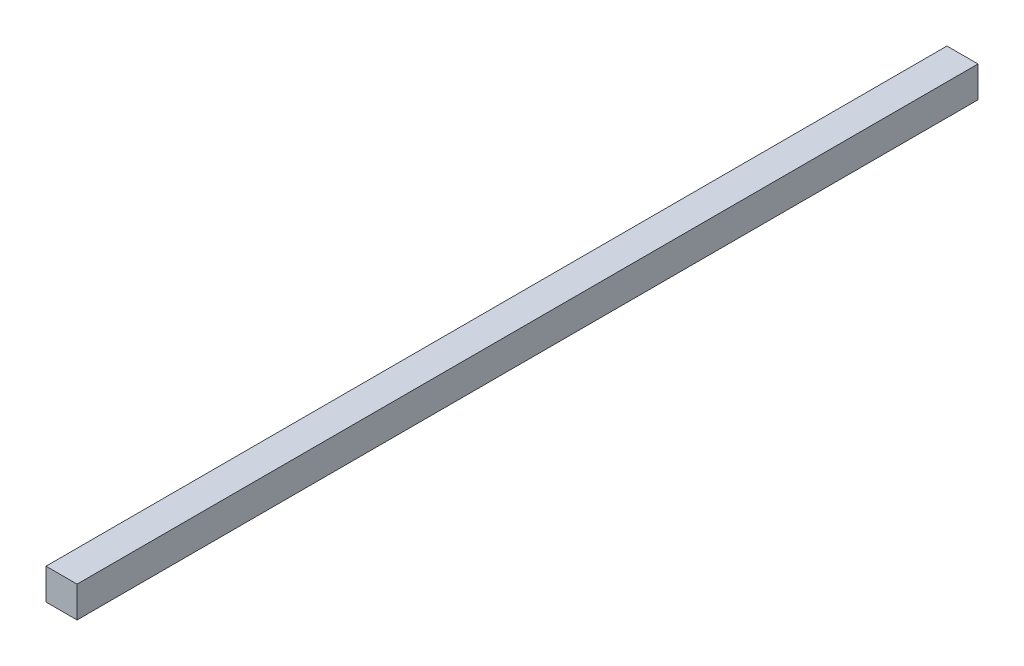
ISO-10303-21;
HEADER;
FILE_DESCRIPTION(('STEP AP214'),'2;1');
FILE_NAME('part.step','',(''),(''),'','','');
FILE_SCHEMA(('AUTOMOTIVE_DESIGN { 1 0 10303 214 1 1 1 1 }'));
ENDSEC;
DATA;
#1=APPLICATION_CONTEXT('core data for automotive mechanical design processes');
#2=APPLICATION_PROTOCOL_DEFINITION('international standard','automotive_design',2000,#1);
#3=PRODUCT_CONTEXT('',#1,'mechanical');
#4=PRODUCT('Part','Part','',(#3));
#5=PRODUCT_RELATED_PRODUCT_CATEGORY('part','',(#4));
#6=PRODUCT_DEFINITION_FORMATION('','',#4);
#7=PRODUCT_DEFINITION_CONTEXT('part definition',#1,'design');
#8=PRODUCT_DEFINITION('design','',#6,#7);
#9=PRODUCT_DEFINITION_SHAPE('','',#8);
#10=(LENGTH_UNIT() NAMED_UNIT(*) SI_UNIT(.MILLI.,.METRE.));
#11=(NAMED_UNIT(*) PLANE_ANGLE_UNIT() SI_UNIT($,.RADIAN.));
#12=(NAMED_UNIT(*) SI_UNIT($,.STERADIAN.) SOLID_ANGLE_UNIT());
#13=UNCERTAINTY_MEASURE_WITH_UNIT(LENGTH_MEASURE(1.E-05),#10,'distance_accuracy_value','');
#14=(GEOMETRIC_REPRESENTATION_CONTEXT(3) GLOBAL_UNCERTAINTY_ASSIGNED_CONTEXT((#13)) GLOBAL_UNIT_ASSIGNED_CONTEXT((#10,
#11,#12)) REPRESENTATION_CONTEXT('',''));
#15=CARTESIAN_POINT('',(0.,0.,0.));
#16=DIRECTION('',(0.,0.,1.));
#17=DIRECTION('',(1.,0.,0.));
#18=AXIS2_PLACEMENT_3D('',#15,#16,#17);
#19=CARTESIAN_POINT('',(10.,-10.,580.));
#20=DIRECTION('',(-1.,0.,0.));
#21=DIRECTION('',(0.,0.,1.));
#22=AXIS2_PLACEMENT_3D('',#19,#20,#21);
#23=PLANE('',#22);
#24=DIRECTION('',(0.,1.,0.));
#25=VECTOR('',#24,1.);
#26=CARTESIAN_POINT('',(10.,-10.,0.));
#27=LINE('',#26,#25);
#28=CARTESIAN_POINT('',(10.,-10.,0.));
#29=VERTEX_POINT('',#28);
#30=CARTESIAN_POINT('',(10.,10.,0.));
#31=VERTEX_POINT('',#30);
#32=EDGE_CURVE('E107',#29,#31,#27,.T.);
#33=ORIENTED_EDGE('',*,*,#32,.T.);
#34=DIRECTION('',(0.,0.,-1.));
#35=VECTOR('',#34,1.);
#36=CARTESIAN_POINT('',(10.,10.,580.));
#37=LINE('',#36,#35);
#38=CARTESIAN_POINT('',(10.,10.,580.));
#39=VERTEX_POINT('',#38);
#40=EDGE_CURVE('E11',#39,#31,#37,.T.);
#41=ORIENTED_EDGE('',*,*,#40,.F.);
#42=DIRECTION('',(0.,1.,0.));
#43=VECTOR('',#42,1.);
#44=CARTESIAN_POINT('',(10.,-10.,580.));
#45=LINE('',#44,#43);
#46=CARTESIAN_POINT('',(10.,-10.,580.));
#47=VERTEX_POINT('',#46);
#48=EDGE_CURVE('E91',#47,#39,#45,.T.);
#49=ORIENTED_EDGE('',*,*,#48,.F.);
#50=DIRECTION('',(0.,0.,-1.));
#51=VECTOR('',#50,1.);
#52=CARTESIAN_POINT('',(10.,-10.,580.));
#53=LINE('',#52,#51);
#54=EDGE_CURVE('E103',#47,#29,#53,.T.);
#55=ORIENTED_EDGE('',*,*,#54,.T.);
#56=EDGE_LOOP('',(#33,#41,#49,#55));
#57=FACE_BOUND('',#56,.T.);
#58=ADVANCED_FACE('F39',(#57),#23,.F.);
#59=CARTESIAN_POINT('',(-10.,10.,580.));
#60=DIRECTION('',(0.,-1.,0.));
#61=DIRECTION('',(0.,0.,-1.));
#62=AXIS2_PLACEMENT_3D('',#59,#60,#61);
#63=PLANE('',#62);
#64=DIRECTION('',(-1.,0.,0.));
#65=VECTOR('',#64,1.);
#66=CARTESIAN_POINT('',(-10.,10.,0.));
#67=LINE('',#66,#65);
#68=CARTESIAN_POINT('',(-10.,10.,0.));
#69=VERTEX_POINT('',#68);
#70=EDGE_CURVE('E96',#31,#69,#67,.T.);
#71=ORIENTED_EDGE('',*,*,#70,.T.);
#72=DIRECTION('',(0.,0.,-1.));
#73=VECTOR('',#72,1.);
#74=CARTESIAN_POINT('',(-10.,10.,580.));
#75=LINE('',#74,#73);
#76=CARTESIAN_POINT('',(-10.,10.,580.));
#77=VERTEX_POINT('',#76);
#78=EDGE_CURVE('E48',#77,#69,#75,.T.);
#79=ORIENTED_EDGE('',*,*,#78,.F.);
#80=DIRECTION('',(-1.,0.,0.));
#81=VECTOR('',#80,1.);
#82=CARTESIAN_POINT('',(-10.,10.,580.));
#83=LINE('',#82,#81);
#84=EDGE_CURVE('E86',#39,#77,#83,.T.);
#85=ORIENTED_EDGE('',*,*,#84,.F.);
#86=ORIENTED_EDGE('',*,*,#40,.T.);
#87=EDGE_LOOP('',(#71,#79,#85,#86));
#88=FACE_BOUND('',#87,.T.);
#89=ADVANCED_FACE('F95',(#88),#63,.F.);
#90=CARTESIAN_POINT('',(-10.,-10.,580.));
#91=DIRECTION('',(1.,0.,0.));
#92=DIRECTION('',(0.,0.,-1.));
#93=AXIS2_PLACEMENT_3D('',#90,#91,#92);
#94=PLANE('',#93);
#95=DIRECTION('',(0.,-1.,0.));
#96=VECTOR('',#95,1.);
#97=CARTESIAN_POINT('',(-10.,-10.,0.));
#98=LINE('',#97,#96);
#99=CARTESIAN_POINT('',(-10.,-10.,0.));
#100=VERTEX_POINT('',#99);
#101=EDGE_CURVE('E73',#69,#100,#98,.T.);
#102=ORIENTED_EDGE('',*,*,#101,.T.);
#103=DIRECTION('',(0.,0.,-1.));
#104=VECTOR('',#103,1.);
#105=CARTESIAN_POINT('',(-10.,-10.,580.));
#106=LINE('',#105,#104);
#107=CARTESIAN_POINT('',(-10.,-10.,580.));
#108=VERTEX_POINT('',#107);
#109=EDGE_CURVE('E98',#108,#100,#106,.T.);
#110=ORIENTED_EDGE('',*,*,#109,.F.);
#111=DIRECTION('',(0.,-1.,0.));
#112=VECTOR('',#111,1.);
#113=CARTESIAN_POINT('',(-10.,-10.,580.));
#114=LINE('',#113,#112);
#115=EDGE_CURVE('E89',#77,#108,#114,.T.);
#116=ORIENTED_EDGE('',*,*,#115,.F.);
#117=ORIENTED_EDGE('',*,*,#78,.T.);
#118=EDGE_LOOP('',(#102,#110,#116,#117));
#119=FACE_BOUND('',#118,.T.);
#120=ADVANCED_FACE('F99',(#119),#94,.F.);
#121=CARTESIAN_POINT('',(-10.,-10.,580.));
#122=DIRECTION('',(0.,1.,0.));
#123=DIRECTION('',(0.,0.,1.));
#124=AXIS2_PLACEMENT_3D('',#121,#122,#123);
#125=PLANE('',#124);
#126=DIRECTION('',(1.,0.,0.));
#127=VECTOR('',#126,1.);
#128=CARTESIAN_POINT('',(-10.,-10.,0.));
#129=LINE('',#128,#127);
#130=EDGE_CURVE('E79',#100,#29,#129,.T.);
#131=ORIENTED_EDGE('',*,*,#130,.T.);
#132=ORIENTED_EDGE('',*,*,#54,.F.);
#133=DIRECTION('',(1.,0.,0.));
#134=VECTOR('',#133,1.);
#135=CARTESIAN_POINT('',(-10.,-10.,580.));
#136=LINE('',#135,#134);
#137=EDGE_CURVE('E56',#108,#47,#136,.T.);
#138=ORIENTED_EDGE('',*,*,#137,.F.);
#139=ORIENTED_EDGE('',*,*,#109,.T.);
#140=EDGE_LOOP('',(#131,#132,#138,#139));
#141=FACE_BOUND('',#140,.T.);
#142=ADVANCED_FACE('F121',(#141),#125,.F.);
#143=CARTESIAN_POINT('',(0.,0.,580.));
#144=DIRECTION('',(0.,0.,-1.));
#145=DIRECTION('',(-1.,0.,0.));
#146=AXIS2_PLACEMENT_3D('',#143,#144,#145);
#147=PLANE('',#146);
#148=ORIENTED_EDGE('',*,*,#48,.T.);
#149=ORIENTED_EDGE('',*,*,#84,.T.);
#150=ORIENTED_EDGE('',*,*,#115,.T.);
#151=ORIENTED_EDGE('',*,*,#137,.T.);
#152=EDGE_LOOP('',(#148,#149,#150,#151));
#153=FACE_BOUND('',#152,.T.);
#154=ADVANCED_FACE('F87',(#153),#147,.F.);
#155=CARTESIAN_POINT('',(0.,0.,0.));
#156=DIRECTION('',(0.,0.,-1.));
#157=DIRECTION('',(-1.,0.,0.));
#158=AXIS2_PLACEMENT_3D('',#155,#156,#157);
#159=PLANE('',#158);
#160=CARTESIAN_POINT('',(0.,0.,0.));
#161=DIRECTION('',(0.,0.,-1.));
#162=DIRECTION('',(-1.,0.,0.));
#163=AXIS2_PLACEMENT_3D('',#160,#161,#162);
#164=CIRCLE('',#163,7.5);
#165=CARTESIAN_POINT('',(-7.5,0.,0.));
#166=VERTEX_POINT('',#165);
#167=EDGE_CURVE('E128',#166,#166,#164,.T.);
#168=ORIENTED_EDGE('',*,*,#167,.F.);
#169=EDGE_LOOP('',(#168));
#170=FACE_BOUND('',#169,.T.);
#171=ORIENTED_EDGE('',*,*,#32,.F.);
#172=ORIENTED_EDGE('',*,*,#130,.F.);
#173=ORIENTED_EDGE('',*,*,#101,.F.);
#174=ORIENTED_EDGE('',*,*,#70,.F.);
#175=EDGE_LOOP('',(#171,#172,#173,#174));
#176=FACE_BOUND('',#175,.T.);
#177=ADVANCED_FACE('F124',(#170,#176),#159,.T.);
#178=CARTESIAN_POINT('',(0.,0.,15.));
#179=DIRECTION('',(0.,0.,-1.));
#180=DIRECTION('',(-1.,0.,0.));
#181=AXIS2_PLACEMENT_3D('',#178,#179,#180);
#182=CYLINDRICAL_SURFACE('',#181,7.5);
#183=CARTESIAN_POINT('',(0.,0.,15.));
#184=DIRECTION('',(0.,0.,-1.));
#185=DIRECTION('',(-1.,0.,0.));
#186=AXIS2_PLACEMENT_3D('',#183,#184,#185);
#187=CIRCLE('',#186,7.5);
#188=CARTESIAN_POINT('',(-7.5,0.,15.));
#189=VERTEX_POINT('',#188);
#190=EDGE_CURVE('E111',#189,#189,#187,.T.);
#191=ORIENTED_EDGE('',*,*,#190,.F.);
#192=EDGE_LOOP('',(#191));
#193=FACE_BOUND('',#192,.T.);
#194=ORIENTED_EDGE('',*,*,#167,.T.);
#195=EDGE_LOOP('',(#194));
#196=FACE_BOUND('',#195,.T.);
#197=ADVANCED_FACE('F138',(#193,#196),#182,.F.);
#198=CARTESIAN_POINT('',(0.,0.,15.));
#199=DIRECTION('',(0.,0.,-1.));
#200=DIRECTION('',(-1.,0.,0.));
#201=AXIS2_PLACEMENT_3D('',#198,#199,#200);
#202=PLANE('',#201);
#203=ORIENTED_EDGE('',*,*,#190,.T.);
#204=EDGE_LOOP('',(#203));
#205=FACE_BOUND('',#204,.T.);
#206=ADVANCED_FACE('F136',(#205),#202,.T.);
#207=CLOSED_SHELL('',(#58,#89,#120,#142,#154,#177,#197,#206));
#208=MANIFOLD_SOLID_BREP('B2',#207);
#209=ADVANCED_BREP_SHAPE_REPRESENTATION('',(#18,#208),#14);
#210=SHAPE_DEFINITION_REPRESENTATION(#9,#209);
ENDSEC;
END-ISO-10303-21;
